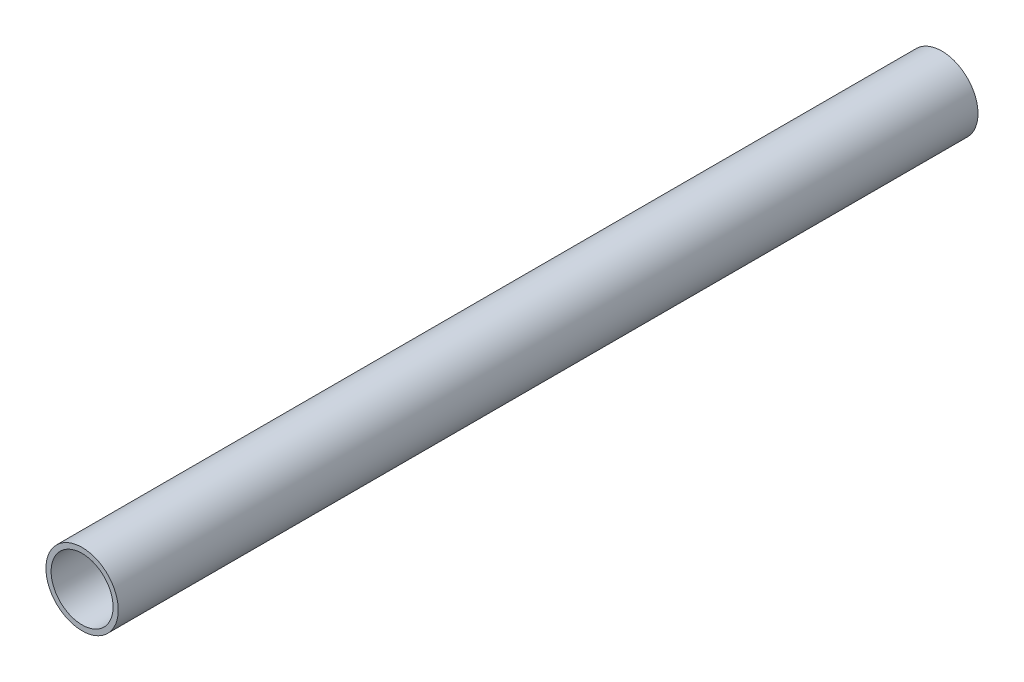
ISO-10303-21;
HEADER;
FILE_DESCRIPTION(('STEP AP214'),'2;1');
FILE_NAME('part.step','',(''),(''),'','','');
FILE_SCHEMA(('AUTOMOTIVE_DESIGN { 1 0 10303 214 1 1 1 1 }'));
ENDSEC;
DATA;
#1=APPLICATION_CONTEXT('core data for automotive mechanical design processes');
#2=APPLICATION_PROTOCOL_DEFINITION('international standard','automotive_design',2000,#1);
#3=PRODUCT_CONTEXT('',#1,'mechanical');
#4=PRODUCT('Part','Part','',(#3));
#5=PRODUCT_RELATED_PRODUCT_CATEGORY('part','',(#4));
#6=PRODUCT_DEFINITION_FORMATION('','',#4);
#7=PRODUCT_DEFINITION_CONTEXT('part definition',#1,'design');
#8=PRODUCT_DEFINITION('design','',#6,#7);
#9=PRODUCT_DEFINITION_SHAPE('','',#8);
#10=(LENGTH_UNIT() NAMED_UNIT(*) SI_UNIT(.MILLI.,.METRE.));
#11=(NAMED_UNIT(*) PLANE_ANGLE_UNIT() SI_UNIT($,.RADIAN.));
#12=(NAMED_UNIT(*) SI_UNIT($,.STERADIAN.) SOLID_ANGLE_UNIT());
#13=UNCERTAINTY_MEASURE_WITH_UNIT(LENGTH_MEASURE(1.E-05),#10,'distance_accuracy_value','');
#14=(GEOMETRIC_REPRESENTATION_CONTEXT(3) GLOBAL_UNCERTAINTY_ASSIGNED_CONTEXT((#13)) GLOBAL_UNIT_ASSIGNED_CONTEXT((#10,
#11,#12)) REPRESENTATION_CONTEXT('',''));
#15=CARTESIAN_POINT('',(0.,0.,0.));
#16=DIRECTION('',(0.,0.,1.));
#17=DIRECTION('',(1.,0.,0.));
#18=AXIS2_PLACEMENT_3D('',#15,#16,#17);
#19=CARTESIAN_POINT('',(0.,0.,132.107958542));
#20=DIRECTION('',(0.,0.,1.));
#21=DIRECTION('',(1.,0.,0.));
#22=AXIS2_PLACEMENT_3D('',#19,#20,#21);
#23=PLANE('',#22);
#24=CARTESIAN_POINT('',(0.,0.,132.107958542));
#25=DIRECTION('',(0.,0.,1.));
#26=DIRECTION('',(1.,0.,0.));
#27=AXIS2_PLACEMENT_3D('',#24,#25,#26);
#28=CIRCLE('',#27,11.1125);
#29=CARTESIAN_POINT('',(11.1125,0.,132.107958542));
#30=VERTEX_POINT('',#29);
#31=EDGE_CURVE('E10',#30,#30,#28,.T.);
#32=ORIENTED_EDGE('',*,*,#31,.T.);
#33=EDGE_LOOP('',(#32));
#34=FACE_BOUND('',#33,.T.);
#35=CARTESIAN_POINT('',(0.,0.,132.107958542));
#36=DIRECTION('',(0.,0.,1.));
#37=DIRECTION('',(1.,0.,0.));
#38=AXIS2_PLACEMENT_3D('',#35,#36,#37);
#39=CIRCLE('',#38,9.525);
#40=CARTESIAN_POINT('',(9.525,0.,132.107958542));
#41=VERTEX_POINT('',#40);
#42=EDGE_CURVE('E43',#41,#41,#39,.T.);
#43=ORIENTED_EDGE('',*,*,#42,.F.);
#44=EDGE_LOOP('',(#43));
#45=FACE_BOUND('',#44,.T.);
#46=ADVANCED_FACE('F32',(#34,#45),#23,.T.);
#47=CARTESIAN_POINT('',(0.,0.,-132.107958542));
#48=DIRECTION('',(0.,0.,1.));
#49=DIRECTION('',(1.,0.,0.));
#50=AXIS2_PLACEMENT_3D('',#47,#48,#49);
#51=PLANE('',#50);
#52=CARTESIAN_POINT('',(0.,0.,-132.107958542));
#53=DIRECTION('',(0.,0.,1.));
#54=DIRECTION('',(1.,0.,0.));
#55=AXIS2_PLACEMENT_3D('',#52,#53,#54);
#56=CIRCLE('',#55,11.1125);
#57=CARTESIAN_POINT('',(11.1125,0.,-132.107958542));
#58=VERTEX_POINT('',#57);
#59=EDGE_CURVE('E36',#58,#58,#56,.T.);
#60=ORIENTED_EDGE('',*,*,#59,.F.);
#61=EDGE_LOOP('',(#60));
#62=FACE_BOUND('',#61,.T.);
#63=CARTESIAN_POINT('',(0.,0.,-132.107958542));
#64=DIRECTION('',(0.,0.,1.));
#65=DIRECTION('',(1.,0.,0.));
#66=AXIS2_PLACEMENT_3D('',#63,#64,#65);
#67=CIRCLE('',#66,9.525);
#68=CARTESIAN_POINT('',(9.525,0.,-132.107958542));
#69=VERTEX_POINT('',#68);
#70=EDGE_CURVE('E45',#69,#69,#67,.T.);
#71=ORIENTED_EDGE('',*,*,#70,.T.);
#72=EDGE_LOOP('',(#71));
#73=FACE_BOUND('',#72,.T.);
#74=ADVANCED_FACE('F55',(#62,#73),#51,.F.);
#75=CARTESIAN_POINT('',(0.,0.,132.107958542));
#76=DIRECTION('',(0.,0.,-1.));
#77=DIRECTION('',(-1.,0.,0.));
#78=AXIS2_PLACEMENT_3D('',#75,#76,#77);
#79=CYLINDRICAL_SURFACE('',#78,11.1125);
#80=ORIENTED_EDGE('',*,*,#31,.F.);
#81=EDGE_LOOP('',(#80));
#82=FACE_BOUND('',#81,.T.);
#83=ORIENTED_EDGE('',*,*,#59,.T.);
#84=EDGE_LOOP('',(#83));
#85=FACE_BOUND('',#84,.T.);
#86=ADVANCED_FACE('F34',(#82,#85),#79,.T.);
#87=CARTESIAN_POINT('',(0.,0.,132.107958542));
#88=DIRECTION('',(0.,0.,-1.));
#89=DIRECTION('',(-1.,0.,0.));
#90=AXIS2_PLACEMENT_3D('',#87,#88,#89);
#91=CYLINDRICAL_SURFACE('',#90,9.525);
#92=ORIENTED_EDGE('',*,*,#42,.T.);
#93=EDGE_LOOP('',(#92));
#94=FACE_BOUND('',#93,.T.);
#95=ORIENTED_EDGE('',*,*,#70,.F.);
#96=EDGE_LOOP('',(#95));
#97=FACE_BOUND('',#96,.T.);
#98=ADVANCED_FACE('F51',(#94,#97),#91,.F.);
#99=CLOSED_SHELL('',(#46,#74,#86,#98));
#100=MANIFOLD_SOLID_BREP('B2',#99);
#101=ADVANCED_BREP_SHAPE_REPRESENTATION('',(#18,#100),#14);
#102=SHAPE_DEFINITION_REPRESENTATION(#9,#101);
ENDSEC;
END-ISO-10303-21;
